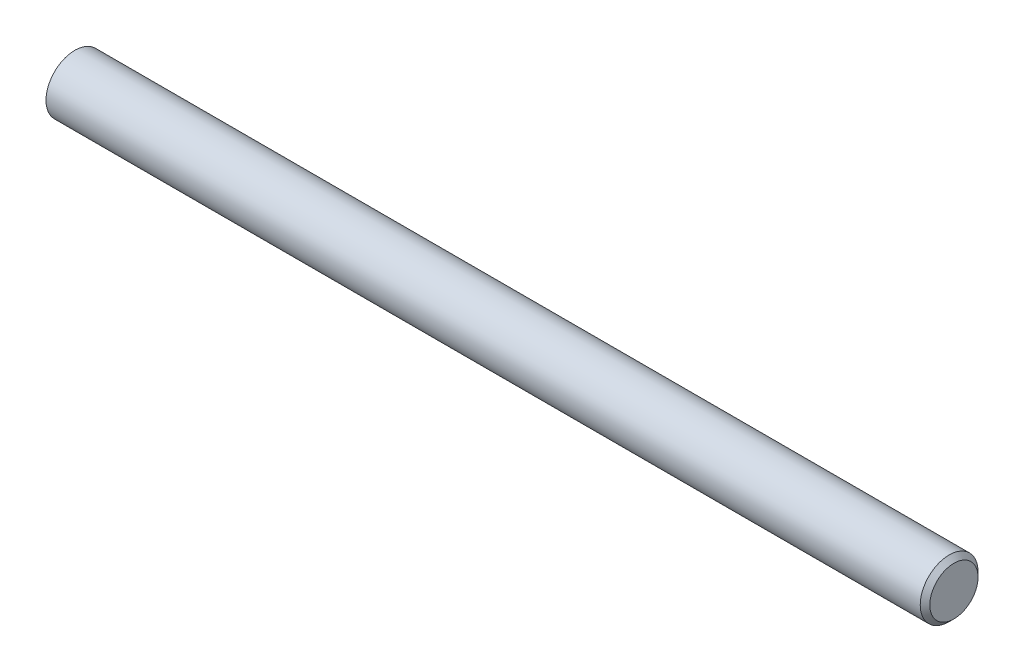
ISO-10303-21;
HEADER;
FILE_DESCRIPTION(('STEP AP214'),'2;1');
FILE_NAME('part.step','',(''),(''),'','','');
FILE_SCHEMA(('AUTOMOTIVE_DESIGN { 1 0 10303 214 1 1 1 1 }'));
ENDSEC;
DATA;
#1=APPLICATION_CONTEXT('core data for automotive mechanical design processes');
#2=APPLICATION_PROTOCOL_DEFINITION('international standard','automotive_design',2000,#1);
#3=PRODUCT_CONTEXT('',#1,'mechanical');
#4=PRODUCT('Part','Part','',(#3));
#5=PRODUCT_RELATED_PRODUCT_CATEGORY('part','',(#4));
#6=PRODUCT_DEFINITION_FORMATION('','',#4);
#7=PRODUCT_DEFINITION_CONTEXT('part definition',#1,'design');
#8=PRODUCT_DEFINITION('design','',#6,#7);
#9=PRODUCT_DEFINITION_SHAPE('','',#8);
#10=(LENGTH_UNIT() NAMED_UNIT(*) SI_UNIT(.MILLI.,.METRE.));
#11=(NAMED_UNIT(*) PLANE_ANGLE_UNIT() SI_UNIT($,.RADIAN.));
#12=(NAMED_UNIT(*) SI_UNIT($,.STERADIAN.) SOLID_ANGLE_UNIT());
#13=UNCERTAINTY_MEASURE_WITH_UNIT(LENGTH_MEASURE(1.E-05),#10,'distance_accuracy_value','');
#14=(GEOMETRIC_REPRESENTATION_CONTEXT(3) GLOBAL_UNCERTAINTY_ASSIGNED_CONTEXT((#13)) GLOBAL_UNIT_ASSIGNED_CONTEXT((#10,
#11,#12)) REPRESENTATION_CONTEXT('',''));
#15=CARTESIAN_POINT('',(0.,0.,0.));
#16=DIRECTION('',(0.,0.,1.));
#17=DIRECTION('',(1.,0.,0.));
#18=AXIS2_PLACEMENT_3D('',#15,#16,#17);
#19=CARTESIAN_POINT('',(0.,0.,0.));
#20=DIRECTION('',(-1.,0.,0.));
#21=DIRECTION('',(0.,0.,1.));
#22=AXIS2_PLACEMENT_3D('',#19,#20,#21);
#23=PLANE('',#22);
#24=CARTESIAN_POINT('',(0.,0.,0.));
#25=DIRECTION('',(-1.,0.,0.));
#26=DIRECTION('',(0.,0.,1.));
#27=AXIS2_PLACEMENT_3D('',#24,#25,#26);
#28=CIRCLE('',#27,5.);
#29=CARTESIAN_POINT('',(0.,0.,5.));
#30=VERTEX_POINT('',#29);
#31=EDGE_CURVE('E10',#30,#30,#28,.T.);
#32=ORIENTED_EDGE('',*,*,#31,.T.);
#33=EDGE_LOOP('',(#32));
#34=FACE_BOUND('',#33,.T.);
#35=ADVANCED_FACE('F30',(#34),#23,.T.);
#36=CARTESIAN_POINT('',(-31.75,0.,0.));
#37=DIRECTION('',(-1.,0.,0.));
#38=DIRECTION('',(0.,0.,1.));
#39=AXIS2_PLACEMENT_3D('',#36,#37,#38);
#40=CYLINDRICAL_SURFACE('',#39,5.);
#41=CARTESIAN_POINT('',(151.172,0.,0.));
#42=DIRECTION('',(-1.,0.,0.));
#43=DIRECTION('',(0.,0.,1.));
#44=AXIS2_PLACEMENT_3D('',#41,#42,#43);
#45=CIRCLE('',#44,5.);
#46=CARTESIAN_POINT('',(151.172,0.,5.));
#47=VERTEX_POINT('',#46);
#48=EDGE_CURVE('E36',#47,#47,#45,.T.);
#49=ORIENTED_EDGE('',*,*,#48,.T.);
#50=EDGE_LOOP('',(#49));
#51=FACE_BOUND('',#50,.T.);
#52=ORIENTED_EDGE('',*,*,#31,.F.);
#53=EDGE_LOOP('',(#52));
#54=FACE_BOUND('',#53,.T.);
#55=ADVANCED_FACE('F55',(#51,#54),#40,.T.);
#56=CARTESIAN_POINT('',(152.,0.,0.));
#57=DIRECTION('',(-1.,0.,0.));
#58=DIRECTION('',(0.,0.,1.));
#59=AXIS2_PLACEMENT_3D('',#56,#57,#58);
#60=CONICAL_SURFACE('',#59,4.17200000000002,0.785398163397373);
#61=ORIENTED_EDGE('',*,*,#48,.F.);
#62=EDGE_LOOP('',(#61));
#63=FACE_BOUND('',#62,.T.);
#64=CARTESIAN_POINT('',(152.,0.,0.));
#65=DIRECTION('',(-1.,0.,0.));
#66=DIRECTION('',(0.,0.,1.));
#67=AXIS2_PLACEMENT_3D('',#64,#65,#66);
#68=CIRCLE('',#67,4.17200000000002);
#69=CARTESIAN_POINT('',(152.,0.,4.17200000000002));
#70=VERTEX_POINT('',#69);
#71=EDGE_CURVE('E40',#70,#70,#68,.T.);
#72=ORIENTED_EDGE('',*,*,#71,.T.);
#73=EDGE_LOOP('',(#72));
#74=FACE_BOUND('',#73,.T.);
#75=ADVANCED_FACE('F47',(#63,#74),#60,.T.);
#76=CARTESIAN_POINT('',(152.,4.17200000000002,0.));
#77=DIRECTION('',(1.,0.,0.));
#78=DIRECTION('',(0.,0.,-1.));
#79=AXIS2_PLACEMENT_3D('',#76,#77,#78);
#80=PLANE('',#79);
#81=ORIENTED_EDGE('',*,*,#71,.F.);
#82=EDGE_LOOP('',(#81));
#83=FACE_BOUND('',#82,.T.);
#84=ADVANCED_FACE('F49',(#83),#80,.T.);
#85=CLOSED_SHELL('',(#35,#55,#75,#84));
#86=MANIFOLD_SOLID_BREP('B2',#85);
#87=ADVANCED_BREP_SHAPE_REPRESENTATION('',(#18,#86),#14);
#88=SHAPE_DEFINITION_REPRESENTATION(#9,#87);
ENDSEC;
END-ISO-10303-21;
